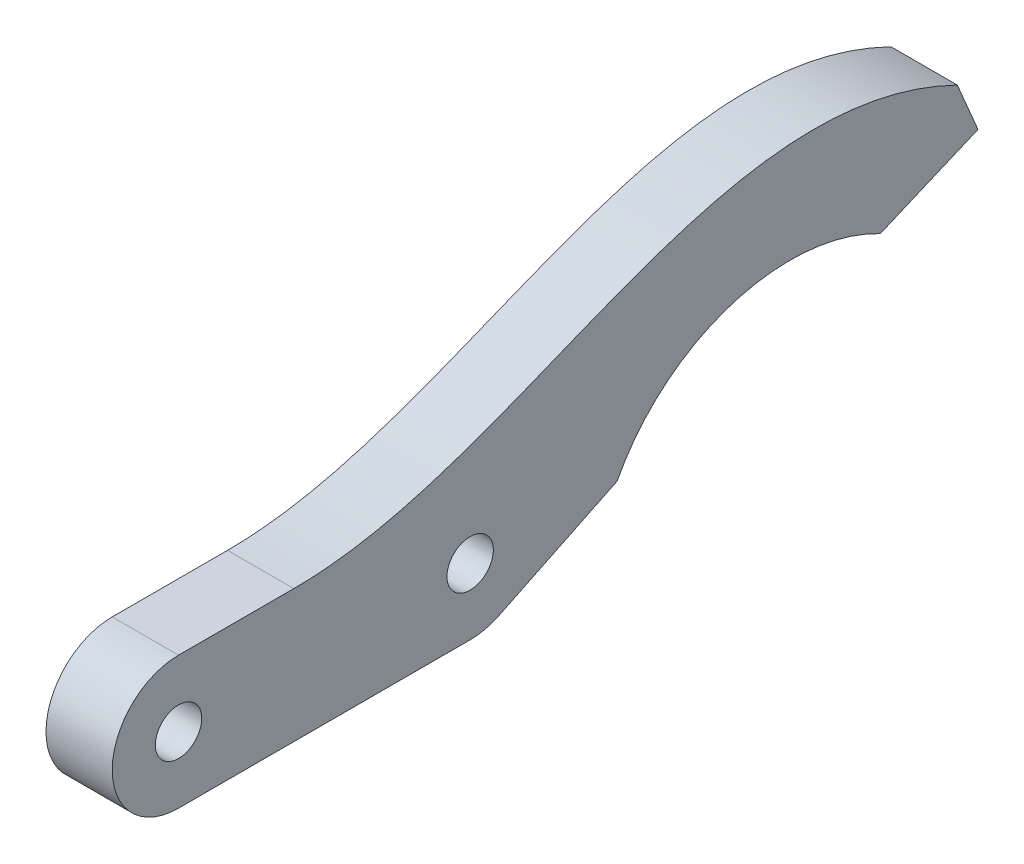
ISO-10303-21;
HEADER;
FILE_DESCRIPTION(('STEP AP214'),'2;1');
FILE_NAME('part.step','',(''),(''),'','','');
FILE_SCHEMA(('AUTOMOTIVE_DESIGN { 1 0 10303 214 1 1 1 1 }'));
ENDSEC;
DATA;
#1=APPLICATION_CONTEXT('core data for automotive mechanical design processes');
#2=APPLICATION_PROTOCOL_DEFINITION('international standard','automotive_design',2000,#1);
#3=PRODUCT_CONTEXT('',#1,'mechanical');
#4=PRODUCT('Part','Part','',(#3));
#5=PRODUCT_RELATED_PRODUCT_CATEGORY('part','',(#4));
#6=PRODUCT_DEFINITION_FORMATION('','',#4);
#7=PRODUCT_DEFINITION_CONTEXT('part definition',#1,'design');
#8=PRODUCT_DEFINITION('design','',#6,#7);
#9=PRODUCT_DEFINITION_SHAPE('','',#8);
#10=(LENGTH_UNIT() NAMED_UNIT(*) SI_UNIT(.MILLI.,.METRE.));
#11=(NAMED_UNIT(*) PLANE_ANGLE_UNIT() SI_UNIT($,.RADIAN.));
#12=(NAMED_UNIT(*) SI_UNIT($,.STERADIAN.) SOLID_ANGLE_UNIT());
#13=UNCERTAINTY_MEASURE_WITH_UNIT(LENGTH_MEASURE(1.E-05),#10,'distance_accuracy_value','');
#14=(GEOMETRIC_REPRESENTATION_CONTEXT(3) GLOBAL_UNCERTAINTY_ASSIGNED_CONTEXT((#13)) GLOBAL_UNIT_ASSIGNED_CONTEXT((#10,
#11,#12)) REPRESENTATION_CONTEXT('',''));
#15=CARTESIAN_POINT('',(0.,0.,0.));
#16=DIRECTION('',(0.,0.,1.));
#17=DIRECTION('',(1.,0.,0.));
#18=AXIS2_PLACEMENT_3D('',#15,#16,#17);
#19=CARTESIAN_POINT('',(5.,5.,-27.));
#20=DIRECTION('',(-1.,0.,0.));
#21=DIRECTION('',(0.,0.,1.));
#22=AXIS2_PLACEMENT_3D('',#19,#20,#21);
#23=CYLINDRICAL_SURFACE('',#22,5.);
#24=DIRECTION('',(1.,0.,0.));
#25=VECTOR('',#24,1.);
#26=CARTESIAN_POINT('',(0.,0.502127655445501,-29.1838370754458));
#27=LINE('',#26,#25);
#28=CARTESIAN_POINT('',(0.,0.502127655445501,-29.1838370754458));
#29=VERTEX_POINT('',#28);
#30=CARTESIAN_POINT('',(5.,0.502127655445501,-29.1838370754458));
#31=VERTEX_POINT('',#30);
#32=EDGE_CURVE('E192',#29,#31,#27,.T.);
#33=ORIENTED_EDGE('',*,*,#32,.T.);
#34=CARTESIAN_POINT('',(5.,5.,-27.));
#35=DIRECTION('',(1.,0.,0.));
#36=DIRECTION('',(0.,0.,-1.));
#37=AXIS2_PLACEMENT_3D('',#34,#35,#36);
#38=CIRCLE('',#37,5.);
#39=CARTESIAN_POINT('',(5.,0.,-27.));
#40=VERTEX_POINT('',#39);
#41=EDGE_CURVE('E204',#40,#31,#38,.T.);
#42=ORIENTED_EDGE('',*,*,#41,.F.);
#43=DIRECTION('',(-1.,0.,0.));
#44=VECTOR('',#43,1.);
#45=CARTESIAN_POINT('',(5.,0.,-27.));
#46=LINE('',#45,#44);
#47=CARTESIAN_POINT('',(0.,0.,-27.));
#48=VERTEX_POINT('',#47);
#49=EDGE_CURVE('E212',#40,#48,#46,.T.);
#50=ORIENTED_EDGE('',*,*,#49,.T.);
#51=CARTESIAN_POINT('',(0.,5.,-27.));
#52=DIRECTION('',(1.,0.,0.));
#53=DIRECTION('',(0.,0.,-1.));
#54=AXIS2_PLACEMENT_3D('',#51,#52,#53);
#55=CIRCLE('',#54,5.);
#56=EDGE_CURVE('E216',#48,#29,#55,.T.);
#57=ORIENTED_EDGE('',*,*,#56,.T.);
#58=EDGE_LOOP('',(#33,#42,#50,#57));
#59=FACE_BOUND('',#58,.T.);
#60=ADVANCED_FACE('F37',(#59),#23,.T.);
#61=CARTESIAN_POINT('',(5.,10.,0.));
#62=DIRECTION('',(0.,1.,0.));
#63=DIRECTION('',(0.,0.,1.));
#64=AXIS2_PLACEMENT_3D('',#61,#62,#63);
#65=PLANE('',#64);
#66=DIRECTION('',(1.,0.,0.));
#67=VECTOR('',#66,1.);
#68=CARTESIAN_POINT('',(0.,10.,-13.6949747586838));
#69=LINE('',#68,#67);
#70=CARTESIAN_POINT('',(0.,10.,-13.6949747586838));
#71=VERTEX_POINT('',#70);
#72=CARTESIAN_POINT('',(5.,10.,-13.6949747586838));
#73=VERTEX_POINT('',#72);
#74=EDGE_CURVE('E127',#71,#73,#69,.T.);
#75=ORIENTED_EDGE('',*,*,#74,.F.);
#76=DIRECTION('',(0.,0.,-1.));
#77=VECTOR('',#76,1.);
#78=CARTESIAN_POINT('',(0.,10.,0.));
#79=LINE('',#78,#77);
#80=CARTESIAN_POINT('',(0.,10.,-5.));
#81=VERTEX_POINT('',#80);
#82=EDGE_CURVE('E138',#81,#71,#79,.T.);
#83=ORIENTED_EDGE('',*,*,#82,.F.);
#84=DIRECTION('',(-1.,0.,0.));
#85=VECTOR('',#84,1.);
#86=CARTESIAN_POINT('',(5.,10.,-5.));
#87=LINE('',#86,#85);
#88=CARTESIAN_POINT('',(5.,10.,-5.));
#89=VERTEX_POINT('',#88);
#90=EDGE_CURVE('E11',#89,#81,#87,.T.);
#91=ORIENTED_EDGE('',*,*,#90,.F.);
#92=DIRECTION('',(0.,0.,-1.));
#93=VECTOR('',#92,1.);
#94=CARTESIAN_POINT('',(5.,10.,0.));
#95=LINE('',#94,#93);
#96=EDGE_CURVE('E191',#89,#73,#95,.T.);
#97=ORIENTED_EDGE('',*,*,#96,.T.);
#98=EDGE_LOOP('',(#75,#83,#91,#97));
#99=FACE_BOUND('',#98,.T.);
#100=ADVANCED_FACE('F39',(#99),#65,.T.);
#101=CARTESIAN_POINT('',(5.,5.,-5.));
#102=DIRECTION('',(-1.,0.,0.));
#103=DIRECTION('',(0.,0.,1.));
#104=AXIS2_PLACEMENT_3D('',#101,#102,#103);
#105=CYLINDRICAL_SURFACE('',#104,5.);
#106=CARTESIAN_POINT('',(0.,5.,-5.));
#107=DIRECTION('',(1.,0.,0.));
#108=DIRECTION('',(0.,0.,-1.));
#109=AXIS2_PLACEMENT_3D('',#106,#107,#108);
#110=CIRCLE('',#109,5.);
#111=CARTESIAN_POINT('',(0.,0.,-5.));
#112=VERTEX_POINT('',#111);
#113=EDGE_CURVE('E67',#81,#112,#110,.T.);
#114=ORIENTED_EDGE('',*,*,#113,.T.);
#115=DIRECTION('',(-1.,0.,0.));
#116=VECTOR('',#115,1.);
#117=CARTESIAN_POINT('',(5.,0.,-5.));
#118=LINE('',#117,#116);
#119=CARTESIAN_POINT('',(5.,0.,-5.));
#120=VERTEX_POINT('',#119);
#121=EDGE_CURVE('E46',#120,#112,#118,.T.);
#122=ORIENTED_EDGE('',*,*,#121,.F.);
#123=CARTESIAN_POINT('',(5.,5.,-5.));
#124=DIRECTION('',(1.,0.,0.));
#125=DIRECTION('',(0.,0.,-1.));
#126=AXIS2_PLACEMENT_3D('',#123,#124,#125);
#127=CIRCLE('',#126,5.);
#128=EDGE_CURVE('E200',#89,#120,#127,.T.);
#129=ORIENTED_EDGE('',*,*,#128,.F.);
#130=ORIENTED_EDGE('',*,*,#90,.T.);
#131=EDGE_LOOP('',(#114,#122,#129,#130));
#132=FACE_BOUND('',#131,.T.);
#133=ADVANCED_FACE('F183',(#132),#105,.T.);
#134=CARTESIAN_POINT('',(5.,0.,0.));
#135=DIRECTION('',(0.,1.,0.));
#136=DIRECTION('',(0.,0.,1.));
#137=AXIS2_PLACEMENT_3D('',#134,#135,#136);
#138=PLANE('',#137);
#139=DIRECTION('',(0.,0.,-1.));
#140=VECTOR('',#139,1.);
#141=CARTESIAN_POINT('',(0.,0.,0.));
#142=LINE('',#141,#140);
#143=EDGE_CURVE('E72',#112,#48,#142,.T.);
#144=ORIENTED_EDGE('',*,*,#143,.T.);
#145=ORIENTED_EDGE('',*,*,#49,.F.);
#146=DIRECTION('',(0.,0.,-1.));
#147=VECTOR('',#146,1.);
#148=CARTESIAN_POINT('',(5.,0.,0.));
#149=LINE('',#148,#147);
#150=EDGE_CURVE('E54',#120,#40,#149,.T.);
#151=ORIENTED_EDGE('',*,*,#150,.F.);
#152=ORIENTED_EDGE('',*,*,#121,.T.);
#153=EDGE_LOOP('',(#144,#145,#151,#152));
#154=FACE_BOUND('',#153,.T.);
#155=ADVANCED_FACE('F177',(#154),#138,.F.);
#156=CARTESIAN_POINT('',(5.,5.,-5.));
#157=DIRECTION('',(-1.,0.,0.));
#158=DIRECTION('',(0.,0.,1.));
#159=AXIS2_PLACEMENT_3D('',#156,#157,#158);
#160=CYLINDRICAL_SURFACE('',#159,1.75);
#161=CARTESIAN_POINT('',(5.,5.,-5.));
#162=DIRECTION('',(1.,0.,0.));
#163=DIRECTION('',(0.,0.,-1.));
#164=AXIS2_PLACEMENT_3D('',#161,#162,#163);
#165=CIRCLE('',#164,1.75);
#166=CARTESIAN_POINT('',(5.,5.,-6.75));
#167=VERTEX_POINT('',#166);
#168=EDGE_CURVE('E206',#167,#167,#165,.T.);
#169=ORIENTED_EDGE('',*,*,#168,.T.);
#170=EDGE_LOOP('',(#169));
#171=FACE_BOUND('',#170,.T.);
#172=CARTESIAN_POINT('',(0.,5.,-5.));
#173=DIRECTION('',(1.,0.,0.));
#174=DIRECTION('',(0.,0.,-1.));
#175=AXIS2_PLACEMENT_3D('',#172,#173,#174);
#176=CIRCLE('',#175,1.75);
#177=CARTESIAN_POINT('',(0.,5.,-6.75));
#178=VERTEX_POINT('',#177);
#179=EDGE_CURVE('E219',#178,#178,#176,.T.);
#180=ORIENTED_EDGE('',*,*,#179,.F.);
#181=EDGE_LOOP('',(#180));
#182=FACE_BOUND('',#181,.T.);
#183=ADVANCED_FACE('F173',(#171,#182),#160,.F.);
#184=CARTESIAN_POINT('',(5.,5.,-27.));
#185=DIRECTION('',(-1.,0.,0.));
#186=DIRECTION('',(0.,0.,1.));
#187=AXIS2_PLACEMENT_3D('',#184,#185,#186);
#188=CYLINDRICAL_SURFACE('',#187,1.75);
#189=CARTESIAN_POINT('',(5.,5.,-27.));
#190=DIRECTION('',(1.,0.,0.));
#191=DIRECTION('',(0.,0.,-1.));
#192=AXIS2_PLACEMENT_3D('',#189,#190,#191);
#193=CIRCLE('',#192,1.75);
#194=CARTESIAN_POINT('',(5.,5.,-28.75));
#195=VERTEX_POINT('',#194);
#196=EDGE_CURVE('E209',#195,#195,#193,.T.);
#197=ORIENTED_EDGE('',*,*,#196,.T.);
#198=EDGE_LOOP('',(#197));
#199=FACE_BOUND('',#198,.T.);
#200=CARTESIAN_POINT('',(0.,5.,-27.));
#201=DIRECTION('',(1.,0.,0.));
#202=DIRECTION('',(0.,0.,-1.));
#203=AXIS2_PLACEMENT_3D('',#200,#201,#202);
#204=CIRCLE('',#203,1.75);
#205=CARTESIAN_POINT('',(0.,5.,-28.75));
#206=VERTEX_POINT('',#205);
#207=EDGE_CURVE('E201',#206,#206,#204,.T.);
#208=ORIENTED_EDGE('',*,*,#207,.F.);
#209=EDGE_LOOP('',(#208));
#210=FACE_BOUND('',#209,.T.);
#211=ADVANCED_FACE('F168',(#199,#210),#188,.F.);
#212=CARTESIAN_POINT('',(5.,0.,0.));
#213=DIRECTION('',(1.,0.,0.));
#214=DIRECTION('',(0.,0.,-1.));
#215=AXIS2_PLACEMENT_3D('',#212,#213,#214);
#216=PLANE('',#215);
#217=ORIENTED_EDGE('',*,*,#96,.F.);
#218=ORIENTED_EDGE('',*,*,#128,.T.);
#219=ORIENTED_EDGE('',*,*,#150,.T.);
#220=ORIENTED_EDGE('',*,*,#41,.T.);
#221=DIRECTION('',(0.,0.436767415089167,-0.8995744689109));
#222=VECTOR('',#221,1.);
#223=CARTESIAN_POINT('',(5.,-11.0601312365663,-5.36998891997289));
#224=LINE('',#223,#222);
#225=CARTESIAN_POINT('',(5.,4.82408407678908,-38.0854206599091));
#226=VERTEX_POINT('',#225);
#227=EDGE_CURVE('E232',#31,#226,#224,.T.);
#228=ORIENTED_EDGE('',*,*,#227,.T.);
#229=CARTESIAN_POINT('',(5.,-1.98532600262506,-51.1385903292835));
#230=DIRECTION('',(1.,0.,0.));
#231=DIRECTION('',(0.,0.,-1.));
#232=AXIS2_PLACEMENT_3D('',#229,#230,#231);
#233=CIRCLE('',#232,14.7225440752304);
#234=CARTESIAN_POINT('',(5.,11.0678436667493,-57.9480004086976));
#235=VERTEX_POINT('',#234);
#236=EDGE_CURVE('E146',#226,#235,#233,.F.);
#237=ORIENTED_EDGE('',*,*,#236,.T.);
#238=DIRECTION('',(0.,0.39020935118337,-0.920726160293631));
#239=VECTOR('',#238,1.);
#240=CARTESIAN_POINT('',(5.,-11.4367064909869,-4.84694582599828));
#241=LINE('',#240,#239);
#242=CARTESIAN_POINT('',(5.,14.1895184762162,-65.3138096910467));
#243=VERTEX_POINT('',#242);
#244=EDGE_CURVE('E143',#235,#243,#241,.T.);
#245=ORIENTED_EDGE('',*,*,#244,.T.);
#246=DIRECTION('',(0.,0.920726160293631,0.39020935118337));
#247=VECTOR('',#246,1.);
#248=CARTESIAN_POINT('',(5.,25.6262249672031,-60.4668638650484));
#249=LINE('',#248,#247);
#250=CARTESIAN_POINT('',(5.,17.8724231173908,-63.7529722863132));
#251=VERTEX_POINT('',#250);
#252=EDGE_CURVE('E238',#243,#251,#249,.T.);
#253=ORIENTED_EDGE('',*,*,#252,.T.);
#254=CARTESIAN_POINT('',(5.,17.8724231173908,-63.7529722863132));
#255=CARTESIAN_POINT('',(5.,26.563787962677,-45.9288826779558));
#256=CARTESIAN_POINT('',(5.,10.,-31.059268620705));
#257=CARTESIAN_POINT('',(5.,10.,-13.6949747586838));
#258=B_SPLINE_CURVE_WITH_KNOTS('',3,(#254,#255,#256,#257),.UNSPECIFIED.,.F.,.F.,(4,4),(0.,1.),.UNSPECIFIED.);
#259=EDGE_CURVE('E122',#251,#73,#258,.T.);
#260=ORIENTED_EDGE('',*,*,#259,.T.);
#261=EDGE_LOOP('',(#217,#218,#219,#220,#228,#237,#245,#253,#260));
#262=FACE_BOUND('',#261,.T.);
#263=ORIENTED_EDGE('',*,*,#168,.F.);
#264=EDGE_LOOP('',(#263));
#265=FACE_BOUND('',#264,.T.);
#266=ORIENTED_EDGE('',*,*,#196,.F.);
#267=EDGE_LOOP('',(#266));
#268=FACE_BOUND('',#267,.T.);
#269=ADVANCED_FACE('F165',(#262,#265,#268),#216,.T.);
#270=CARTESIAN_POINT('',(0.,0.,0.));
#271=DIRECTION('',(1.,0.,0.));
#272=DIRECTION('',(0.,0.,-1.));
#273=AXIS2_PLACEMENT_3D('',#270,#271,#272);
#274=PLANE('',#273);
#275=ORIENTED_EDGE('',*,*,#82,.T.);
#276=CARTESIAN_POINT('',(0.,17.8724231173908,-63.7529722863132));
#277=CARTESIAN_POINT('',(0.,26.563787962677,-45.9288826779558));
#278=CARTESIAN_POINT('',(0.,10.,-31.059268620705));
#279=CARTESIAN_POINT('',(0.,10.,-13.6949747586838));
#280=B_SPLINE_CURVE_WITH_KNOTS('',3,(#276,#277,#278,#279),.UNSPECIFIED.,.F.,.F.,(4,4),(0.,1.),.UNSPECIFIED.);
#281=CARTESIAN_POINT('',(0.,17.8724231173908,-63.7529722863132));
#282=VERTEX_POINT('',#281);
#283=EDGE_CURVE('E119',#282,#71,#280,.T.);
#284=ORIENTED_EDGE('',*,*,#283,.F.);
#285=DIRECTION('',(0.,0.920726160293631,0.39020935118337));
#286=VECTOR('',#285,1.);
#287=CARTESIAN_POINT('',(0.,25.6262249672031,-60.4668638650484));
#288=LINE('',#287,#286);
#289=CARTESIAN_POINT('',(0.,14.1895184762162,-65.3138096910467));
#290=VERTEX_POINT('',#289);
#291=EDGE_CURVE('E136',#290,#282,#288,.T.);
#292=ORIENTED_EDGE('',*,*,#291,.F.);
#293=DIRECTION('',(0.,0.39020935118337,-0.920726160293631));
#294=VECTOR('',#293,1.);
#295=CARTESIAN_POINT('',(0.,-11.4367064909869,-4.84694582599828));
#296=LINE('',#295,#294);
#297=CARTESIAN_POINT('',(0.,11.0678436667493,-57.9480004086976));
#298=VERTEX_POINT('',#297);
#299=EDGE_CURVE('E128',#298,#290,#296,.T.);
#300=ORIENTED_EDGE('',*,*,#299,.F.);
#301=CARTESIAN_POINT('',(0.,-1.98532600262506,-51.1385903292835));
#302=DIRECTION('',(1.,0.,0.));
#303=DIRECTION('',(0.,0.,-1.));
#304=AXIS2_PLACEMENT_3D('',#301,#302,#303);
#305=CIRCLE('',#304,14.7225440752304);
#306=CARTESIAN_POINT('',(0.,4.82408407678908,-38.0854206599091));
#307=VERTEX_POINT('',#306);
#308=EDGE_CURVE('E249',#307,#298,#305,.F.);
#309=ORIENTED_EDGE('',*,*,#308,.F.);
#310=DIRECTION('',(0.,0.436767415089167,-0.8995744689109));
#311=VECTOR('',#310,1.);
#312=CARTESIAN_POINT('',(0.,-11.0601312365663,-5.36998891997289));
#313=LINE('',#312,#311);
#314=EDGE_CURVE('E139',#29,#307,#313,.T.);
#315=ORIENTED_EDGE('',*,*,#314,.F.);
#316=ORIENTED_EDGE('',*,*,#56,.F.);
#317=ORIENTED_EDGE('',*,*,#143,.F.);
#318=ORIENTED_EDGE('',*,*,#113,.F.);
#319=EDGE_LOOP('',(#275,#284,#292,#300,#309,#315,#316,#317,#318));
#320=FACE_BOUND('',#319,.T.);
#321=ORIENTED_EDGE('',*,*,#179,.T.);
#322=EDGE_LOOP('',(#321));
#323=FACE_BOUND('',#322,.T.);
#324=ORIENTED_EDGE('',*,*,#207,.T.);
#325=EDGE_LOOP('',(#324));
#326=FACE_BOUND('',#325,.T.);
#327=ADVANCED_FACE('F133',(#320,#323,#326),#274,.F.);
#328=CARTESIAN_POINT('',(0.,25.6262249672031,-60.4668638650484));
#329=DIRECTION('',(0.,0.39020935118337,-0.920726160293631));
#330=DIRECTION('',(0.,0.920726160293631,0.39020935118337));
#331=AXIS2_PLACEMENT_3D('',#328,#329,#330);
#332=PLANE('',#331);
#333=ORIENTED_EDGE('',*,*,#252,.F.);
#334=DIRECTION('',(1.,0.,0.));
#335=VECTOR('',#334,1.);
#336=CARTESIAN_POINT('',(0.,14.1895184762162,-65.3138096910467));
#337=LINE('',#336,#335);
#338=EDGE_CURVE('E142',#290,#243,#337,.T.);
#339=ORIENTED_EDGE('',*,*,#338,.F.);
#340=ORIENTED_EDGE('',*,*,#291,.T.);
#341=DIRECTION('',(1.,0.,0.));
#342=VECTOR('',#341,1.);
#343=CARTESIAN_POINT('',(0.,17.8724231173908,-63.7529722863132));
#344=LINE('',#343,#342);
#345=EDGE_CURVE('E116',#282,#251,#344,.T.);
#346=ORIENTED_EDGE('',*,*,#345,.T.);
#347=EDGE_LOOP('',(#333,#339,#340,#346));
#348=FACE_BOUND('',#347,.T.);
#349=ADVANCED_FACE('F141',(#348),#332,.T.);
#350=CARTESIAN_POINT('',(0.,-11.4367064909869,-4.84694582599828));
#351=DIRECTION('',(0.,-0.920726160293631,-0.39020935118337));
#352=DIRECTION('',(0.,0.39020935118337,-0.920726160293631));
#353=AXIS2_PLACEMENT_3D('',#350,#351,#352);
#354=PLANE('',#353);
#355=ORIENTED_EDGE('',*,*,#244,.F.);
#356=DIRECTION('',(1.,0.,0.));
#357=VECTOR('',#356,1.);
#358=CARTESIAN_POINT('',(0.,11.0678436667493,-57.9480004086976));
#359=LINE('',#358,#357);
#360=EDGE_CURVE('E245',#298,#235,#359,.T.);
#361=ORIENTED_EDGE('',*,*,#360,.F.);
#362=ORIENTED_EDGE('',*,*,#299,.T.);
#363=ORIENTED_EDGE('',*,*,#338,.T.);
#364=EDGE_LOOP('',(#355,#361,#362,#363));
#365=FACE_BOUND('',#364,.T.);
#366=ADVANCED_FACE('F164',(#365),#354,.T.);
#367=CARTESIAN_POINT('',(0.,-1.98532600262506,-51.1385903292835));
#368=DIRECTION('',(1.,0.,0.));
#369=DIRECTION('',(0.,0.,-1.));
#370=AXIS2_PLACEMENT_3D('',#367,#368,#369);
#371=CYLINDRICAL_SURFACE('',#370,14.7225440752304);
#372=ORIENTED_EDGE('',*,*,#236,.F.);
#373=DIRECTION('',(1.,0.,0.));
#374=VECTOR('',#373,1.);
#375=CARTESIAN_POINT('',(0.,4.82408407678908,-38.0854206599091));
#376=LINE('',#375,#374);
#377=EDGE_CURVE('E195',#307,#226,#376,.T.);
#378=ORIENTED_EDGE('',*,*,#377,.F.);
#379=ORIENTED_EDGE('',*,*,#308,.T.);
#380=ORIENTED_EDGE('',*,*,#360,.T.);
#381=EDGE_LOOP('',(#372,#378,#379,#380));
#382=FACE_BOUND('',#381,.T.);
#383=ADVANCED_FACE('F248',(#382),#371,.F.);
#384=CARTESIAN_POINT('',(0.,-11.0601312365663,-5.36998891997289));
#385=DIRECTION('',(0.,-0.8995744689109,-0.436767415089167));
#386=DIRECTION('',(0.,0.436767415089167,-0.8995744689109));
#387=AXIS2_PLACEMENT_3D('',#384,#385,#386);
#388=PLANE('',#387);
#389=ORIENTED_EDGE('',*,*,#227,.F.);
#390=ORIENTED_EDGE('',*,*,#32,.F.);
#391=ORIENTED_EDGE('',*,*,#314,.T.);
#392=ORIENTED_EDGE('',*,*,#377,.T.);
#393=EDGE_LOOP('',(#389,#390,#391,#392));
#394=FACE_BOUND('',#393,.T.);
#395=ADVANCED_FACE('F160',(#394),#388,.T.);
#396=DIRECTION('',(1.,0.,0.));
#397=VECTOR('',#396,1.);
#398=SURFACE_OF_LINEAR_EXTRUSION('',#280,#397);
#399=ORIENTED_EDGE('',*,*,#259,.F.);
#400=ORIENTED_EDGE('',*,*,#345,.F.);
#401=ORIENTED_EDGE('',*,*,#283,.T.);
#402=ORIENTED_EDGE('',*,*,#74,.T.);
#403=EDGE_LOOP('',(#399,#400,#401,#402));
#404=FACE_BOUND('',#403,.T.);
#405=ADVANCED_FACE('F118',(#404),#398,.T.);
#406=CLOSED_SHELL('',(#60,#100,#133,#155,#183,#211,#269,#327,#349,#366,#383,#395,#405));
#407=MANIFOLD_SOLID_BREP('B2',#406);
#408=ADVANCED_BREP_SHAPE_REPRESENTATION('',(#18,#407),#14);
#409=SHAPE_DEFINITION_REPRESENTATION(#9,#408);
ENDSEC;
END-ISO-10303-21;
